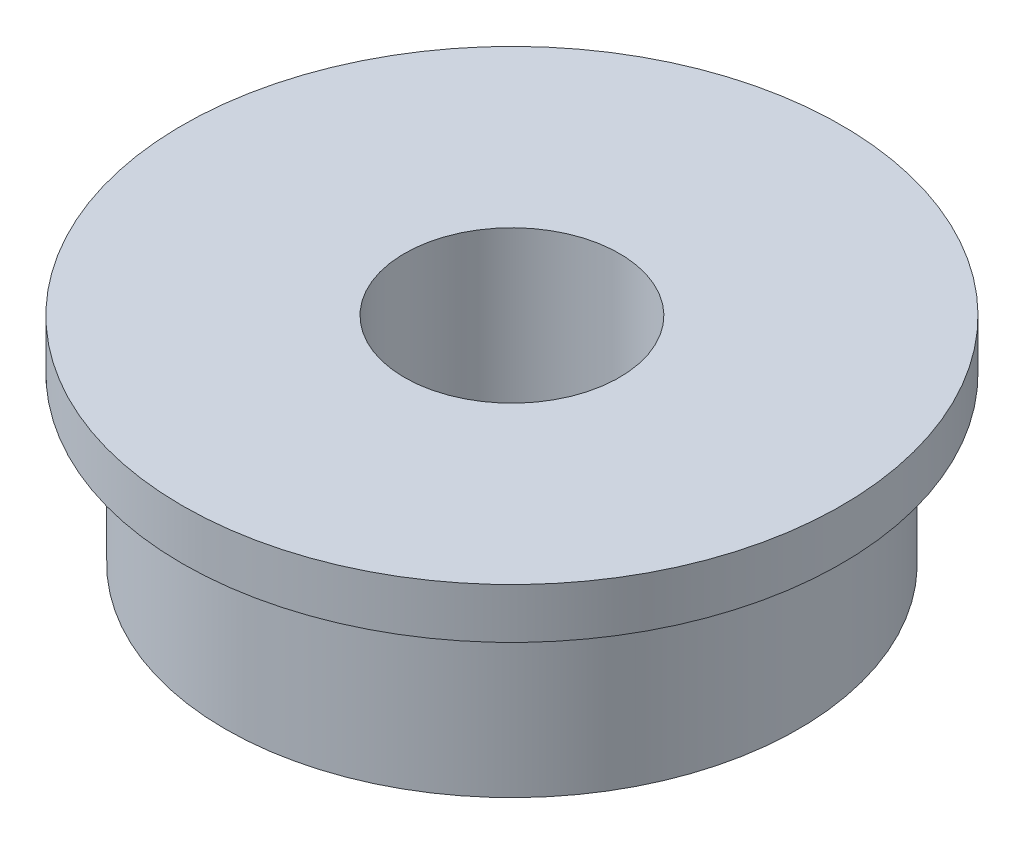
ISO-10303-21;
HEADER;
FILE_DESCRIPTION(('STEP AP214'),'2;1');
FILE_NAME('part.step','',(''),(''),'','','');
FILE_SCHEMA(('AUTOMOTIVE_DESIGN { 1 0 10303 214 1 1 1 1 }'));
ENDSEC;
DATA;
#1=APPLICATION_CONTEXT('core data for automotive mechanical design processes');
#2=APPLICATION_PROTOCOL_DEFINITION('international standard','automotive_design',2000,#1);
#3=PRODUCT_CONTEXT('',#1,'mechanical');
#4=PRODUCT('Part','Part','',(#3));
#5=PRODUCT_RELATED_PRODUCT_CATEGORY('part','',(#4));
#6=PRODUCT_DEFINITION_FORMATION('','',#4);
#7=PRODUCT_DEFINITION_CONTEXT('part definition',#1,'design');
#8=PRODUCT_DEFINITION('design','',#6,#7);
#9=PRODUCT_DEFINITION_SHAPE('','',#8);
#10=(LENGTH_UNIT() NAMED_UNIT(*) SI_UNIT(.MILLI.,.METRE.));
#11=(NAMED_UNIT(*) PLANE_ANGLE_UNIT() SI_UNIT($,.RADIAN.));
#12=(NAMED_UNIT(*) SI_UNIT($,.STERADIAN.) SOLID_ANGLE_UNIT());
#13=UNCERTAINTY_MEASURE_WITH_UNIT(LENGTH_MEASURE(1.E-05),#10,'distance_accuracy_value','');
#14=(GEOMETRIC_REPRESENTATION_CONTEXT(3) GLOBAL_UNCERTAINTY_ASSIGNED_CONTEXT((#13)) GLOBAL_UNIT_ASSIGNED_CONTEXT((#10,
#11,#12)) REPRESENTATION_CONTEXT('',''));
#15=CARTESIAN_POINT('',(0.,0.,0.));
#16=DIRECTION('',(0.,0.,1.));
#17=DIRECTION('',(1.,0.,0.));
#18=AXIS2_PLACEMENT_3D('',#15,#16,#17);
#19=CARTESIAN_POINT('',(0.,8.32415455571286,0.));
#20=DIRECTION('',(0.,1.,0.));
#21=DIRECTION('',(0.,0.,1.));
#22=AXIS2_PLACEMENT_3D('',#19,#20,#21);
#23=CYLINDRICAL_SURFACE('',#22,4.6);
#24=CARTESIAN_POINT('',(0.,6.94213208380275,0.));
#25=DIRECTION('',(0.,1.,0.));
#26=DIRECTION('',(0.,0.,1.));
#27=AXIS2_PLACEMENT_3D('',#24,#25,#26);
#28=CIRCLE('',#27,4.6);
#29=CARTESIAN_POINT('',(0.,6.94213208380275,4.6));
#30=VERTEX_POINT('',#29);
#31=EDGE_CURVE('E54',#30,#30,#28,.T.);
#32=ORIENTED_EDGE('',*,*,#31,.F.);
#33=EDGE_LOOP('',(#32));
#34=FACE_BOUND('',#33,.T.);
#35=CARTESIAN_POINT('',(0.,6.24213208380275,0.));
#36=DIRECTION('',(0.,1.,0.));
#37=DIRECTION('',(0.,0.,1.));
#38=AXIS2_PLACEMENT_3D('',#35,#36,#37);
#39=CIRCLE('',#38,4.6);
#40=CARTESIAN_POINT('',(0.,6.24213208380275,4.6));
#41=VERTEX_POINT('',#40);
#42=EDGE_CURVE('E10',#41,#41,#39,.T.);
#43=ORIENTED_EDGE('',*,*,#42,.T.);
#44=EDGE_LOOP('',(#43));
#45=FACE_BOUND('',#44,.T.);
#46=ADVANCED_FACE('F32',(#34,#45),#23,.T.);
#47=CARTESIAN_POINT('',(4.6,6.24213208380275,0.));
#48=DIRECTION('',(0.,1.,0.));
#49=DIRECTION('',(0.,0.,1.));
#50=AXIS2_PLACEMENT_3D('',#47,#48,#49);
#51=PLANE('',#50);
#52=ORIENTED_EDGE('',*,*,#42,.F.);
#53=EDGE_LOOP('',(#52));
#54=FACE_BOUND('',#53,.T.);
#55=CARTESIAN_POINT('',(0.,6.24213208380275,0.));
#56=DIRECTION('',(0.,1.,0.));
#57=DIRECTION('',(0.,0.,1.));
#58=AXIS2_PLACEMENT_3D('',#55,#56,#57);
#59=CIRCLE('',#58,4.);
#60=CARTESIAN_POINT('',(0.,6.24213208380275,4.));
#61=VERTEX_POINT('',#60);
#62=EDGE_CURVE('E38',#61,#61,#59,.T.);
#63=ORIENTED_EDGE('',*,*,#62,.T.);
#64=EDGE_LOOP('',(#63));
#65=FACE_BOUND('',#64,.T.);
#66=ADVANCED_FACE('F61',(#54,#65),#51,.F.);
#67=CARTESIAN_POINT('',(0.,8.32415455571286,0.));
#68=DIRECTION('',(0.,1.,0.));
#69=DIRECTION('',(0.,0.,1.));
#70=AXIS2_PLACEMENT_3D('',#67,#68,#69);
#71=CYLINDRICAL_SURFACE('',#70,4.);
#72=ORIENTED_EDGE('',*,*,#62,.F.);
#73=EDGE_LOOP('',(#72));
#74=FACE_BOUND('',#73,.T.);
#75=CARTESIAN_POINT('',(0.,3.94213208380275,0.));
#76=DIRECTION('',(0.,1.,0.));
#77=DIRECTION('',(0.,0.,1.));
#78=AXIS2_PLACEMENT_3D('',#75,#76,#77);
#79=CIRCLE('',#78,4.);
#80=CARTESIAN_POINT('',(0.,3.94213208380275,4.));
#81=VERTEX_POINT('',#80);
#82=EDGE_CURVE('E42',#81,#81,#79,.T.);
#83=ORIENTED_EDGE('',*,*,#82,.T.);
#84=EDGE_LOOP('',(#83));
#85=FACE_BOUND('',#84,.T.);
#86=ADVANCED_FACE('F65',(#74,#85),#71,.T.);
#87=CARTESIAN_POINT('',(4.,3.94213208380275,0.));
#88=DIRECTION('',(0.,1.,0.));
#89=DIRECTION('',(0.,0.,1.));
#90=AXIS2_PLACEMENT_3D('',#87,#88,#89);
#91=PLANE('',#90);
#92=ORIENTED_EDGE('',*,*,#82,.F.);
#93=EDGE_LOOP('',(#92));
#94=FACE_BOUND('',#93,.T.);
#95=CARTESIAN_POINT('',(0.,3.94213208380275,0.));
#96=DIRECTION('',(0.,1.,0.));
#97=DIRECTION('',(0.,0.,1.));
#98=AXIS2_PLACEMENT_3D('',#95,#96,#97);
#99=CIRCLE('',#98,1.5);
#100=CARTESIAN_POINT('',(0.,3.94213208380275,1.5));
#101=VERTEX_POINT('',#100);
#102=EDGE_CURVE('E46',#101,#101,#99,.T.);
#103=ORIENTED_EDGE('',*,*,#102,.T.);
#104=EDGE_LOOP('',(#103));
#105=FACE_BOUND('',#104,.T.);
#106=ADVANCED_FACE('F70',(#94,#105),#91,.F.);
#107=CARTESIAN_POINT('',(0.,8.32415455571286,0.));
#108=DIRECTION('',(0.,1.,0.));
#109=DIRECTION('',(0.,0.,1.));
#110=AXIS2_PLACEMENT_3D('',#107,#108,#109);
#111=CYLINDRICAL_SURFACE('',#110,1.5);
#112=ORIENTED_EDGE('',*,*,#102,.F.);
#113=EDGE_LOOP('',(#112));
#114=FACE_BOUND('',#113,.T.);
#115=CARTESIAN_POINT('',(0.,6.94213208380275,0.));
#116=DIRECTION('',(0.,1.,0.));
#117=DIRECTION('',(0.,0.,1.));
#118=AXIS2_PLACEMENT_3D('',#115,#116,#117);
#119=CIRCLE('',#118,1.5);
#120=CARTESIAN_POINT('',(0.,6.94213208380275,1.5));
#121=VERTEX_POINT('',#120);
#122=EDGE_CURVE('E51',#121,#121,#119,.T.);
#123=ORIENTED_EDGE('',*,*,#122,.T.);
#124=EDGE_LOOP('',(#123));
#125=FACE_BOUND('',#124,.T.);
#126=ADVANCED_FACE('F76',(#114,#125),#111,.F.);
#127=CARTESIAN_POINT('',(1.5,6.94213208380275,0.));
#128=DIRECTION('',(0.,-1.,0.));
#129=DIRECTION('',(0.,0.,-1.));
#130=AXIS2_PLACEMENT_3D('',#127,#128,#129);
#131=PLANE('',#130);
#132=ORIENTED_EDGE('',*,*,#122,.F.);
#133=EDGE_LOOP('',(#132));
#134=FACE_BOUND('',#133,.T.);
#135=ORIENTED_EDGE('',*,*,#31,.T.);
#136=EDGE_LOOP('',(#135));
#137=FACE_BOUND('',#136,.T.);
#138=ADVANCED_FACE('F58',(#134,#137),#131,.F.);
#139=CLOSED_SHELL('',(#46,#66,#86,#106,#126,#138));
#140=MANIFOLD_SOLID_BREP('B2',#139);
#141=ADVANCED_BREP_SHAPE_REPRESENTATION('',(#18,#140),#14);
#142=SHAPE_DEFINITION_REPRESENTATION(#9,#141);
ENDSEC;
END-ISO-10303-21;
